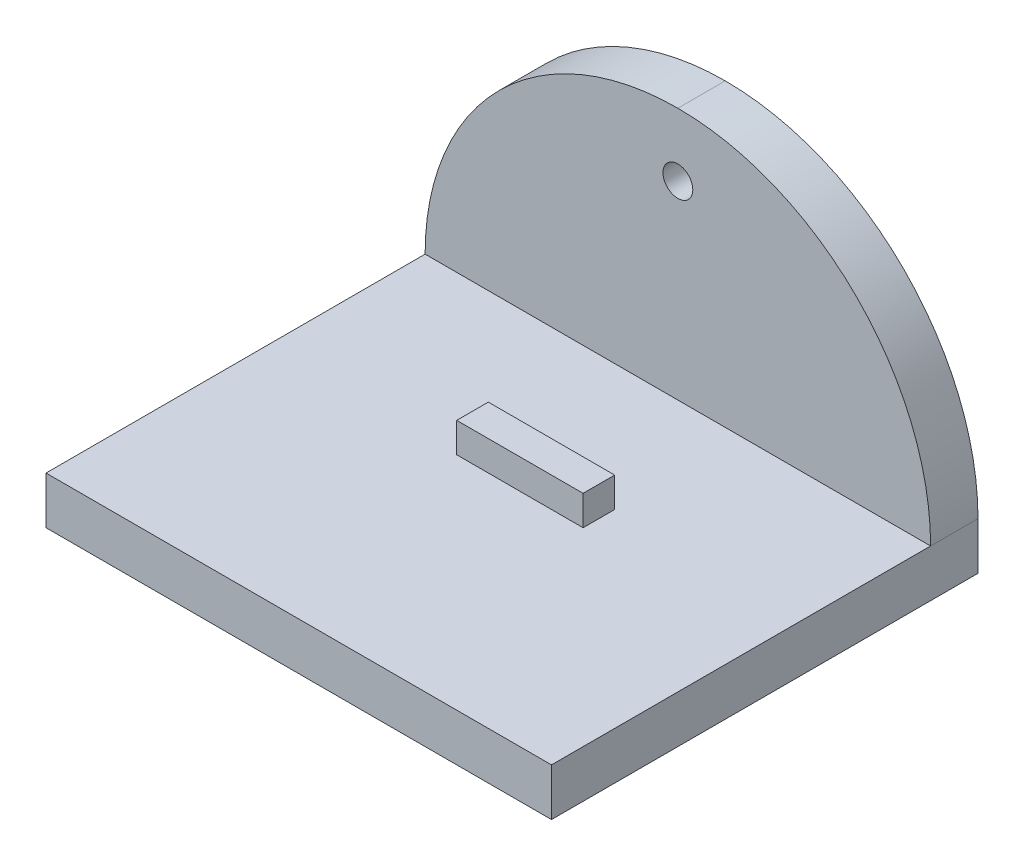
ISO-10303-21;
HEADER;
FILE_DESCRIPTION(('STEP AP214'),'2;1');
FILE_NAME('part.step','',(''),(''),'','','');
FILE_SCHEMA(('AUTOMOTIVE_DESIGN { 1 0 10303 214 1 1 1 1 }'));
ENDSEC;
DATA;
#1=APPLICATION_CONTEXT('core data for automotive mechanical design processes');
#2=APPLICATION_PROTOCOL_DEFINITION('international standard','automotive_design',2000,#1);
#3=PRODUCT_CONTEXT('',#1,'mechanical');
#4=PRODUCT('Part','Part','',(#3));
#5=PRODUCT_RELATED_PRODUCT_CATEGORY('part','',(#4));
#6=PRODUCT_DEFINITION_FORMATION('','',#4);
#7=PRODUCT_DEFINITION_CONTEXT('part definition',#1,'design');
#8=PRODUCT_DEFINITION('design','',#6,#7);
#9=PRODUCT_DEFINITION_SHAPE('','',#8);
#10=(LENGTH_UNIT() NAMED_UNIT(*) SI_UNIT(.MILLI.,.METRE.));
#11=(NAMED_UNIT(*) PLANE_ANGLE_UNIT() SI_UNIT($,.RADIAN.));
#12=(NAMED_UNIT(*) SI_UNIT($,.STERADIAN.) SOLID_ANGLE_UNIT());
#13=UNCERTAINTY_MEASURE_WITH_UNIT(LENGTH_MEASURE(1.E-05),#10,'distance_accuracy_value','');
#14=(GEOMETRIC_REPRESENTATION_CONTEXT(3) GLOBAL_UNCERTAINTY_ASSIGNED_CONTEXT((#13)) GLOBAL_UNIT_ASSIGNED_CONTEXT((#10,
#11,#12)) REPRESENTATION_CONTEXT('',''));
#15=CARTESIAN_POINT('',(0.,0.,0.));
#16=DIRECTION('',(0.,0.,1.));
#17=DIRECTION('',(1.,0.,0.));
#18=AXIS2_PLACEMENT_3D('',#15,#16,#17);
#19=CARTESIAN_POINT('',(50.8,4.7625,42.8625));
#20=DIRECTION('',(0.,-1.,0.));
#21=DIRECTION('',(0.,0.,-1.));
#22=AXIS2_PLACEMENT_3D('',#19,#20,#21);
#23=PLANE('',#22);
#24=DIRECTION('',(0.,0.,1.));
#25=VECTOR('',#24,1.);
#26=CARTESIAN_POINT('',(0.,4.7625,42.8625));
#27=LINE('',#26,#25);
#28=CARTESIAN_POINT('',(0.,4.7625,4.7625));
#29=VERTEX_POINT('',#28);
#30=CARTESIAN_POINT('',(0.,4.7625,42.8625));
#31=VERTEX_POINT('',#30);
#32=EDGE_CURVE('E146',#29,#31,#27,.T.);
#33=ORIENTED_EDGE('',*,*,#32,.T.);
#34=DIRECTION('',(-1.,0.,0.));
#35=VECTOR('',#34,1.);
#36=CARTESIAN_POINT('',(50.8,4.7625,42.8625));
#37=LINE('',#36,#35);
#38=CARTESIAN_POINT('',(50.8,4.7625,42.8625));
#39=VERTEX_POINT('',#38);
#40=EDGE_CURVE('E180',#39,#31,#37,.T.);
#41=ORIENTED_EDGE('',*,*,#40,.F.);
#42=DIRECTION('',(0.,0.,1.));
#43=VECTOR('',#42,1.);
#44=CARTESIAN_POINT('',(50.8,4.7625,42.8625));
#45=LINE('',#44,#43);
#46=CARTESIAN_POINT('',(50.8,4.7625,4.7625));
#47=VERTEX_POINT('',#46);
#48=EDGE_CURVE('E155',#47,#39,#45,.T.);
#49=ORIENTED_EDGE('',*,*,#48,.F.);
#50=DIRECTION('',(-1.,0.,0.));
#51=VECTOR('',#50,1.);
#52=CARTESIAN_POINT('',(50.8,4.7625,4.7625));
#53=LINE('',#52,#51);
#54=EDGE_CURVE('E184',#47,#29,#53,.T.);
#55=ORIENTED_EDGE('',*,*,#54,.T.);
#56=EDGE_LOOP('',(#33,#41,#49,#55));
#57=FACE_BOUND('',#56,.T.);
#58=DIRECTION('',(0.,0.,1.));
#59=VECTOR('',#58,1.);
#60=CARTESIAN_POINT('',(19.05,4.7625,20.6375));
#61=LINE('',#60,#59);
#62=CARTESIAN_POINT('',(19.05,4.7625,17.4625));
#63=VERTEX_POINT('',#62);
#64=CARTESIAN_POINT('',(19.05,4.7625,20.6375));
#65=VERTEX_POINT('',#64);
#66=EDGE_CURVE('E140',#63,#65,#61,.T.);
#67=ORIENTED_EDGE('',*,*,#66,.F.);
#68=DIRECTION('',(-1.,0.,0.));
#69=VECTOR('',#68,1.);
#70=CARTESIAN_POINT('',(19.05,4.7625,17.4625));
#71=LINE('',#70,#69);
#72=CARTESIAN_POINT('',(31.75,4.7625,17.4625));
#73=VERTEX_POINT('',#72);
#74=EDGE_CURVE('E137',#73,#63,#71,.T.);
#75=ORIENTED_EDGE('',*,*,#74,.F.);
#76=DIRECTION('',(0.,0.,-1.));
#77=VECTOR('',#76,1.);
#78=CARTESIAN_POINT('',(31.75,4.7625,20.6375));
#79=LINE('',#78,#77);
#80=CARTESIAN_POINT('',(31.75,4.7625,20.6375));
#81=VERTEX_POINT('',#80);
#82=EDGE_CURVE('E253',#81,#73,#79,.T.);
#83=ORIENTED_EDGE('',*,*,#82,.F.);
#84=DIRECTION('',(1.,0.,0.));
#85=VECTOR('',#84,1.);
#86=CARTESIAN_POINT('',(19.05,4.7625,20.6375));
#87=LINE('',#86,#85);
#88=EDGE_CURVE('E250',#65,#81,#87,.T.);
#89=ORIENTED_EDGE('',*,*,#88,.F.);
#90=EDGE_LOOP('',(#67,#75,#83,#89));
#91=FACE_BOUND('',#90,.T.);
#92=ADVANCED_FACE('F38',(#57,#91),#23,.F.);
#93=CARTESIAN_POINT('',(50.8,30.1625,0.));
#94=DIRECTION('',(0.,0.,1.));
#95=DIRECTION('',(0.,-1.,0.));
#96=AXIS2_PLACEMENT_3D('',#93,#94,#95);
#97=PLANE('',#96);
#98=CARTESIAN_POINT('',(25.4,23.8125,0.));
#99=DIRECTION('',(0.,0.,1.));
#100=DIRECTION('',(1.,0.,0.));
#101=AXIS2_PLACEMENT_3D('',#98,#99,#100);
#102=CIRCLE('',#101,1.499997);
#103=CARTESIAN_POINT('',(26.899997,23.8125,0.));
#104=VERTEX_POINT('',#103);
#105=EDGE_CURVE('E235',#104,#104,#102,.T.);
#106=ORIENTED_EDGE('',*,*,#105,.T.);
#107=EDGE_LOOP('',(#106));
#108=FACE_BOUND('',#107,.T.);
#109=DIRECTION('',(0.,1.,0.));
#110=VECTOR('',#109,1.);
#111=CARTESIAN_POINT('',(0.,30.1625,0.));
#112=LINE('',#111,#110);
#113=CARTESIAN_POINT('',(0.,0.,0.));
#114=VERTEX_POINT('',#113);
#115=CARTESIAN_POINT('',(0.,4.7625,0.));
#116=VERTEX_POINT('',#115);
#117=EDGE_CURVE('E142',#114,#116,#112,.T.);
#118=ORIENTED_EDGE('',*,*,#117,.T.);
#119=CARTESIAN_POINT('',(25.4,4.7625,0.));
#120=DIRECTION('',(0.,0.,1.));
#121=DIRECTION('',(0.,-1.,0.));
#122=AXIS2_PLACEMENT_3D('',#119,#120,#121);
#123=CIRCLE('',#122,25.4);
#124=CARTESIAN_POINT('',(25.4,30.1625,0.));
#125=VERTEX_POINT('',#124);
#126=EDGE_CURVE('E48',#116,#125,#123,.F.);
#127=ORIENTED_EDGE('',*,*,#126,.T.);
#128=CARTESIAN_POINT('',(25.4,4.7625,0.));
#129=DIRECTION('',(0.,0.,1.));
#130=DIRECTION('',(0.,-1.,0.));
#131=AXIS2_PLACEMENT_3D('',#128,#129,#130);
#132=CIRCLE('',#131,25.4);
#133=CARTESIAN_POINT('',(50.8,4.7625,0.));
#134=VERTEX_POINT('',#133);
#135=EDGE_CURVE('E55',#125,#134,#132,.F.);
#136=ORIENTED_EDGE('',*,*,#135,.T.);
#137=DIRECTION('',(0.,1.,0.));
#138=VECTOR('',#137,1.);
#139=CARTESIAN_POINT('',(50.8,30.1625,0.));
#140=LINE('',#139,#138);
#141=CARTESIAN_POINT('',(50.8,0.,0.));
#142=VERTEX_POINT('',#141);
#143=EDGE_CURVE('E152',#142,#134,#140,.T.);
#144=ORIENTED_EDGE('',*,*,#143,.F.);
#145=DIRECTION('',(-1.,0.,0.));
#146=VECTOR('',#145,1.);
#147=CARTESIAN_POINT('',(50.8,0.,0.));
#148=LINE('',#147,#146);
#149=EDGE_CURVE('E164',#142,#114,#148,.T.);
#150=ORIENTED_EDGE('',*,*,#149,.T.);
#151=EDGE_LOOP('',(#118,#127,#136,#144,#150));
#152=FACE_BOUND('',#151,.T.);
#153=ADVANCED_FACE('F210',(#108,#152),#97,.F.);
#154=CARTESIAN_POINT('',(50.8,4.7625,4.7625));
#155=DIRECTION('',(0.,0.,-1.));
#156=DIRECTION('',(0.,1.,0.));
#157=AXIS2_PLACEMENT_3D('',#154,#155,#156);
#158=PLANE('',#157);
#159=CARTESIAN_POINT('',(25.4,23.8125,4.7625));
#160=DIRECTION('',(0.,0.,1.));
#161=DIRECTION('',(1.,0.,0.));
#162=AXIS2_PLACEMENT_3D('',#159,#160,#161);
#163=CIRCLE('',#162,1.499997);
#164=CARTESIAN_POINT('',(26.899997,23.8125,4.7625));
#165=VERTEX_POINT('',#164);
#166=EDGE_CURVE('E232',#165,#165,#163,.T.);
#167=ORIENTED_EDGE('',*,*,#166,.F.);
#168=EDGE_LOOP('',(#167));
#169=FACE_BOUND('',#168,.T.);
#170=CARTESIAN_POINT('',(25.4,4.7625,4.7625));
#171=DIRECTION('',(0.,0.,-1.));
#172=DIRECTION('',(0.,1.,0.));
#173=AXIS2_PLACEMENT_3D('',#170,#171,#172);
#174=CIRCLE('',#173,25.4);
#175=CARTESIAN_POINT('',(25.4,30.1625,4.7625));
#176=VERTEX_POINT('',#175);
#177=EDGE_CURVE('E188',#47,#176,#174,.F.);
#178=ORIENTED_EDGE('',*,*,#177,.T.);
#179=CARTESIAN_POINT('',(25.4,4.7625,4.7625));
#180=DIRECTION('',(0.,0.,-1.));
#181=DIRECTION('',(0.,1.,0.));
#182=AXIS2_PLACEMENT_3D('',#179,#180,#181);
#183=CIRCLE('',#182,25.4);
#184=EDGE_CURVE('E191',#176,#29,#183,.F.);
#185=ORIENTED_EDGE('',*,*,#184,.T.);
#186=ORIENTED_EDGE('',*,*,#54,.F.);
#187=EDGE_LOOP('',(#178,#185,#186));
#188=FACE_BOUND('',#187,.T.);
#189=ADVANCED_FACE('F226',(#169,#188),#158,.F.);
#190=CARTESIAN_POINT('',(50.8,0.,42.8625));
#191=DIRECTION('',(0.,0.,-1.));
#192=DIRECTION('',(-1.,0.,0.));
#193=AXIS2_PLACEMENT_3D('',#190,#191,#192);
#194=PLANE('',#193);
#195=DIRECTION('',(0.,-1.,0.));
#196=VECTOR('',#195,1.);
#197=CARTESIAN_POINT('',(0.,0.,42.8625));
#198=LINE('',#197,#196);
#199=CARTESIAN_POINT('',(0.,0.,42.8625));
#200=VERTEX_POINT('',#199);
#201=EDGE_CURVE('E168',#31,#200,#198,.T.);
#202=ORIENTED_EDGE('',*,*,#201,.T.);
#203=DIRECTION('',(-1.,0.,0.));
#204=VECTOR('',#203,1.);
#205=CARTESIAN_POINT('',(50.8,0.,42.8625));
#206=LINE('',#205,#204);
#207=CARTESIAN_POINT('',(50.8,0.,42.8625));
#208=VERTEX_POINT('',#207);
#209=EDGE_CURVE('E176',#208,#200,#206,.T.);
#210=ORIENTED_EDGE('',*,*,#209,.F.);
#211=DIRECTION('',(0.,-1.,0.));
#212=VECTOR('',#211,1.);
#213=CARTESIAN_POINT('',(50.8,0.,42.8625));
#214=LINE('',#213,#212);
#215=EDGE_CURVE('E159',#39,#208,#214,.T.);
#216=ORIENTED_EDGE('',*,*,#215,.F.);
#217=ORIENTED_EDGE('',*,*,#40,.T.);
#218=EDGE_LOOP('',(#202,#210,#216,#217));
#219=FACE_BOUND('',#218,.T.);
#220=ADVANCED_FACE('F217',(#219),#194,.F.);
#221=CARTESIAN_POINT('',(50.8,0.,0.));
#222=DIRECTION('',(0.,1.,0.));
#223=DIRECTION('',(0.,0.,1.));
#224=AXIS2_PLACEMENT_3D('',#221,#222,#223);
#225=PLANE('',#224);
#226=DIRECTION('',(0.,0.,-1.));
#227=VECTOR('',#226,1.);
#228=CARTESIAN_POINT('',(0.,0.,0.));
#229=LINE('',#228,#227);
#230=EDGE_CURVE('E156',#200,#114,#229,.T.);
#231=ORIENTED_EDGE('',*,*,#230,.T.);
#232=ORIENTED_EDGE('',*,*,#149,.F.);
#233=DIRECTION('',(0.,0.,-1.));
#234=VECTOR('',#233,1.);
#235=CARTESIAN_POINT('',(50.8,0.,0.));
#236=LINE('',#235,#234);
#237=EDGE_CURVE('E162',#208,#142,#236,.T.);
#238=ORIENTED_EDGE('',*,*,#237,.F.);
#239=ORIENTED_EDGE('',*,*,#209,.T.);
#240=EDGE_LOOP('',(#231,#232,#238,#239));
#241=FACE_BOUND('',#240,.T.);
#242=ADVANCED_FACE('F214',(#241),#225,.F.);
#243=CARTESIAN_POINT('',(50.8,0.,0.));
#244=DIRECTION('',(-1.,0.,0.));
#245=DIRECTION('',(0.,0.,1.));
#246=AXIS2_PLACEMENT_3D('',#243,#244,#245);
#247=PLANE('',#246);
#248=ORIENTED_EDGE('',*,*,#143,.T.);
#249=DIRECTION('',(0.,0.,1.));
#250=VECTOR('',#249,1.);
#251=CARTESIAN_POINT('',(50.8,4.7625,0.));
#252=LINE('',#251,#250);
#253=EDGE_CURVE('E11',#134,#47,#252,.T.);
#254=ORIENTED_EDGE('',*,*,#253,.T.);
#255=ORIENTED_EDGE('',*,*,#48,.T.);
#256=ORIENTED_EDGE('',*,*,#215,.T.);
#257=ORIENTED_EDGE('',*,*,#237,.T.);
#258=EDGE_LOOP('',(#248,#254,#255,#256,#257));
#259=FACE_BOUND('',#258,.T.);
#260=ADVANCED_FACE('F293',(#259),#247,.F.);
#261=CARTESIAN_POINT('',(0.,0.,0.));
#262=DIRECTION('',(-1.,0.,0.));
#263=DIRECTION('',(0.,0.,1.));
#264=AXIS2_PLACEMENT_3D('',#261,#262,#263);
#265=PLANE('',#264);
#266=ORIENTED_EDGE('',*,*,#32,.F.);
#267=DIRECTION('',(0.,0.,1.));
#268=VECTOR('',#267,1.);
#269=CARTESIAN_POINT('',(0.,4.7625,0.));
#270=LINE('',#269,#268);
#271=EDGE_CURVE('E194',#29,#116,#270,.F.);
#272=ORIENTED_EDGE('',*,*,#271,.T.);
#273=ORIENTED_EDGE('',*,*,#117,.F.);
#274=ORIENTED_EDGE('',*,*,#230,.F.);
#275=ORIENTED_EDGE('',*,*,#201,.F.);
#276=EDGE_LOOP('',(#266,#272,#273,#274,#275));
#277=FACE_BOUND('',#276,.T.);
#278=ADVANCED_FACE('F205',(#277),#265,.T.);
#279=CARTESIAN_POINT('',(19.05,7.7597,20.6375));
#280=DIRECTION('',(1.,0.,0.));
#281=DIRECTION('',(0.,0.,-1.));
#282=AXIS2_PLACEMENT_3D('',#279,#280,#281);
#283=PLANE('',#282);
#284=ORIENTED_EDGE('',*,*,#66,.T.);
#285=DIRECTION('',(0.,-1.,0.));
#286=VECTOR('',#285,1.);
#287=CARTESIAN_POINT('',(19.05,7.7597,20.6375));
#288=LINE('',#287,#286);
#289=CARTESIAN_POINT('',(19.05,7.7597,20.6375));
#290=VERTEX_POINT('',#289);
#291=EDGE_CURVE('E119',#290,#65,#288,.T.);
#292=ORIENTED_EDGE('',*,*,#291,.F.);
#293=DIRECTION('',(0.,0.,1.));
#294=VECTOR('',#293,1.);
#295=CARTESIAN_POINT('',(19.05,7.7597,20.6375));
#296=LINE('',#295,#294);
#297=CARTESIAN_POINT('',(19.05,7.7597,17.4625));
#298=VERTEX_POINT('',#297);
#299=EDGE_CURVE('E127',#298,#290,#296,.T.);
#300=ORIENTED_EDGE('',*,*,#299,.F.);
#301=DIRECTION('',(0.,-1.,0.));
#302=VECTOR('',#301,1.);
#303=CARTESIAN_POINT('',(19.05,7.7597,17.4625));
#304=LINE('',#303,#302);
#305=EDGE_CURVE('E247',#298,#63,#304,.T.);
#306=ORIENTED_EDGE('',*,*,#305,.T.);
#307=EDGE_LOOP('',(#284,#292,#300,#306));
#308=FACE_BOUND('',#307,.T.);
#309=ADVANCED_FACE('F139',(#308),#283,.F.);
#310=CARTESIAN_POINT('',(19.05,7.7597,20.6375));
#311=DIRECTION('',(0.,0.,-1.));
#312=DIRECTION('',(0.,1.,0.));
#313=AXIS2_PLACEMENT_3D('',#310,#311,#312);
#314=PLANE('',#313);
#315=ORIENTED_EDGE('',*,*,#88,.T.);
#316=DIRECTION('',(0.,-1.,0.));
#317=VECTOR('',#316,1.);
#318=CARTESIAN_POINT('',(31.75,7.7597,20.6375));
#319=LINE('',#318,#317);
#320=CARTESIAN_POINT('',(31.75,7.7597,20.6375));
#321=VERTEX_POINT('',#320);
#322=EDGE_CURVE('E122',#321,#81,#319,.T.);
#323=ORIENTED_EDGE('',*,*,#322,.F.);
#324=DIRECTION('',(1.,0.,0.));
#325=VECTOR('',#324,1.);
#326=CARTESIAN_POINT('',(19.05,7.7597,20.6375));
#327=LINE('',#326,#325);
#328=EDGE_CURVE('E114',#290,#321,#327,.T.);
#329=ORIENTED_EDGE('',*,*,#328,.F.);
#330=ORIENTED_EDGE('',*,*,#291,.T.);
#331=EDGE_LOOP('',(#315,#323,#329,#330));
#332=FACE_BOUND('',#331,.T.);
#333=ADVANCED_FACE('F117',(#332),#314,.F.);
#334=CARTESIAN_POINT('',(31.75,7.7597,20.6375));
#335=DIRECTION('',(-1.,0.,0.));
#336=DIRECTION('',(0.,0.,1.));
#337=AXIS2_PLACEMENT_3D('',#334,#335,#336);
#338=PLANE('',#337);
#339=ORIENTED_EDGE('',*,*,#82,.T.);
#340=DIRECTION('',(0.,-1.,0.));
#341=VECTOR('',#340,1.);
#342=CARTESIAN_POINT('',(31.75,7.7597,17.4625));
#343=LINE('',#342,#341);
#344=CARTESIAN_POINT('',(31.75,7.7597,17.4625));
#345=VERTEX_POINT('',#344);
#346=EDGE_CURVE('E148',#345,#73,#343,.T.);
#347=ORIENTED_EDGE('',*,*,#346,.F.);
#348=DIRECTION('',(0.,0.,-1.));
#349=VECTOR('',#348,1.);
#350=CARTESIAN_POINT('',(31.75,7.7597,20.6375));
#351=LINE('',#350,#349);
#352=EDGE_CURVE('E126',#321,#345,#351,.T.);
#353=ORIENTED_EDGE('',*,*,#352,.F.);
#354=ORIENTED_EDGE('',*,*,#322,.T.);
#355=EDGE_LOOP('',(#339,#347,#353,#354));
#356=FACE_BOUND('',#355,.T.);
#357=ADVANCED_FACE('F267',(#356),#338,.F.);
#358=CARTESIAN_POINT('',(19.05,7.7597,17.4625));
#359=DIRECTION('',(0.,0.,1.));
#360=DIRECTION('',(0.,-1.,0.));
#361=AXIS2_PLACEMENT_3D('',#358,#359,#360);
#362=PLANE('',#361);
#363=ORIENTED_EDGE('',*,*,#74,.T.);
#364=ORIENTED_EDGE('',*,*,#305,.F.);
#365=DIRECTION('',(-1.,0.,0.));
#366=VECTOR('',#365,1.);
#367=CARTESIAN_POINT('',(19.05,7.7597,17.4625));
#368=LINE('',#367,#366);
#369=EDGE_CURVE('E132',#345,#298,#368,.T.);
#370=ORIENTED_EDGE('',*,*,#369,.F.);
#371=ORIENTED_EDGE('',*,*,#346,.T.);
#372=EDGE_LOOP('',(#363,#364,#370,#371));
#373=FACE_BOUND('',#372,.T.);
#374=ADVANCED_FACE('F265',(#373),#362,.F.);
#375=CARTESIAN_POINT('',(0.,7.7597,0.));
#376=DIRECTION('',(0.,-1.,0.));
#377=DIRECTION('',(0.,0.,-1.));
#378=AXIS2_PLACEMENT_3D('',#375,#376,#377);
#379=PLANE('',#378);
#380=ORIENTED_EDGE('',*,*,#299,.T.);
#381=ORIENTED_EDGE('',*,*,#328,.T.);
#382=ORIENTED_EDGE('',*,*,#352,.T.);
#383=ORIENTED_EDGE('',*,*,#369,.T.);
#384=EDGE_LOOP('',(#380,#381,#382,#383));
#385=FACE_BOUND('',#384,.T.);
#386=ADVANCED_FACE('F130',(#385),#379,.F.);
#387=CARTESIAN_POINT('',(25.4,23.8125,0.));
#388=DIRECTION('',(0.,0.,1.));
#389=DIRECTION('',(1.,0.,0.));
#390=AXIS2_PLACEMENT_3D('',#387,#388,#389);
#391=CYLINDRICAL_SURFACE('',#390,1.499997);
#392=ORIENTED_EDGE('',*,*,#105,.F.);
#393=EDGE_LOOP('',(#392));
#394=FACE_BOUND('',#393,.T.);
#395=ORIENTED_EDGE('',*,*,#166,.T.);
#396=EDGE_LOOP('',(#395));
#397=FACE_BOUND('',#396,.T.);
#398=ADVANCED_FACE('F285',(#394,#397),#391,.F.);
#399=CARTESIAN_POINT('',(25.4,4.7625,0.));
#400=DIRECTION('',(0.,0.,1.));
#401=DIRECTION('',(1.,0.,0.));
#402=AXIS2_PLACEMENT_3D('',#399,#400,#401);
#403=CYLINDRICAL_SURFACE('',#402,25.4);
#404=ORIENTED_EDGE('',*,*,#253,.F.);
#405=ORIENTED_EDGE('',*,*,#135,.F.);
#406=DIRECTION('',(0.,0.,1.));
#407=VECTOR('',#406,1.);
#408=CARTESIAN_POINT('',(25.4,30.1625,4.7625));
#409=LINE('',#408,#407);
#410=EDGE_CURVE('E42',#176,#125,#409,.F.);
#411=ORIENTED_EDGE('',*,*,#410,.F.);
#412=ORIENTED_EDGE('',*,*,#177,.F.);
#413=EDGE_LOOP('',(#404,#405,#411,#412));
#414=FACE_BOUND('',#413,.T.);
#415=ADVANCED_FACE('F40',(#414),#403,.T.);
#416=CARTESIAN_POINT('',(25.4,4.7625,4.7625));
#417=DIRECTION('',(0.,0.,-1.));
#418=DIRECTION('',(-1.,0.,0.));
#419=AXIS2_PLACEMENT_3D('',#416,#417,#418);
#420=CYLINDRICAL_SURFACE('',#419,25.4);
#421=ORIENTED_EDGE('',*,*,#126,.F.);
#422=ORIENTED_EDGE('',*,*,#271,.F.);
#423=ORIENTED_EDGE('',*,*,#184,.F.);
#424=ORIENTED_EDGE('',*,*,#410,.T.);
#425=EDGE_LOOP('',(#421,#422,#423,#424));
#426=FACE_BOUND('',#425,.T.);
#427=ADVANCED_FACE('F229',(#426),#420,.T.);
#428=CLOSED_SHELL('',(#92,#153,#189,#220,#242,#260,#278,#309,#333,#357,#374,#386,#398,#415,#427));
#429=MANIFOLD_SOLID_BREP('B2',#428);
#430=ADVANCED_BREP_SHAPE_REPRESENTATION('',(#18,#429),#14);
#431=SHAPE_DEFINITION_REPRESENTATION(#9,#430);
ENDSEC;
END-ISO-10303-21;
